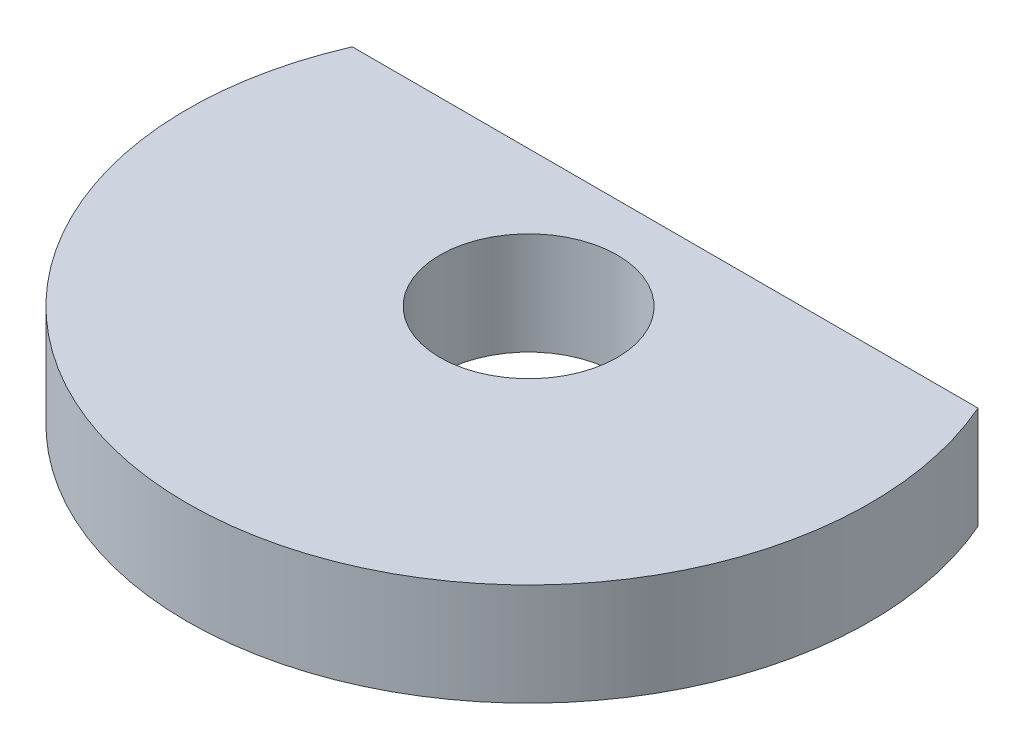
ISO-10303-21;
HEADER;
FILE_DESCRIPTION(('STEP AP214'),'2;1');
FILE_NAME('part.step','',(''),(''),'','','');
FILE_SCHEMA(('AUTOMOTIVE_DESIGN { 1 0 10303 214 1 1 1 1 }'));
ENDSEC;
DATA;
#1=APPLICATION_CONTEXT('core data for automotive mechanical design processes');
#2=APPLICATION_PROTOCOL_DEFINITION('international standard','automotive_design',2000,#1);
#3=PRODUCT_CONTEXT('',#1,'mechanical');
#4=PRODUCT('Part','Part','',(#3));
#5=PRODUCT_RELATED_PRODUCT_CATEGORY('part','',(#4));
#6=PRODUCT_DEFINITION_FORMATION('','',#4);
#7=PRODUCT_DEFINITION_CONTEXT('part definition',#1,'design');
#8=PRODUCT_DEFINITION('design','',#6,#7);
#9=PRODUCT_DEFINITION_SHAPE('','',#8);
#10=(LENGTH_UNIT() NAMED_UNIT(*) SI_UNIT(.MILLI.,.METRE.));
#11=(NAMED_UNIT(*) PLANE_ANGLE_UNIT() SI_UNIT($,.RADIAN.));
#12=(NAMED_UNIT(*) SI_UNIT($,.STERADIAN.) SOLID_ANGLE_UNIT());
#13=UNCERTAINTY_MEASURE_WITH_UNIT(LENGTH_MEASURE(1.E-05),#10,'distance_accuracy_value','');
#14=(GEOMETRIC_REPRESENTATION_CONTEXT(3) GLOBAL_UNCERTAINTY_ASSIGNED_CONTEXT((#13)) GLOBAL_UNIT_ASSIGNED_CONTEXT((#10,
#11,#12)) REPRESENTATION_CONTEXT('',''));
#15=CARTESIAN_POINT('',(0.,0.,0.));
#16=DIRECTION('',(0.,0.,1.));
#17=DIRECTION('',(1.,0.,0.));
#18=AXIS2_PLACEMENT_3D('',#15,#16,#17);
#19=CARTESIAN_POINT('',(0.,3.,-4.));
#20=DIRECTION('',(0.,0.,-1.));
#21=DIRECTION('',(-1.,0.,0.));
#22=AXIS2_PLACEMENT_3D('',#19,#20,#21);
#23=PLANE('',#22);
#24=DIRECTION('',(1.,0.,0.));
#25=VECTOR('',#24,1.);
#26=CARTESIAN_POINT('',(0.,0.,-4.));
#27=LINE('',#26,#25);
#28=CARTESIAN_POINT('',(-9.16515138991168,0.,-4.));
#29=VERTEX_POINT('',#28);
#30=CARTESIAN_POINT('',(9.16515138991168,0.,-4.));
#31=VERTEX_POINT('',#30);
#32=EDGE_CURVE('E71',#29,#31,#27,.T.);
#33=ORIENTED_EDGE('',*,*,#32,.F.);
#34=DIRECTION('',(0.,-1.,0.));
#35=VECTOR('',#34,1.);
#36=CARTESIAN_POINT('',(-9.16515138991168,3.,-4.));
#37=LINE('',#36,#35);
#38=CARTESIAN_POINT('',(-9.16515138991168,3.,-4.));
#39=VERTEX_POINT('',#38);
#40=EDGE_CURVE('E11',#39,#29,#37,.T.);
#41=ORIENTED_EDGE('',*,*,#40,.F.);
#42=DIRECTION('',(1.,0.,0.));
#43=VECTOR('',#42,1.);
#44=CARTESIAN_POINT('',(0.,3.,-4.));
#45=LINE('',#44,#43);
#46=CARTESIAN_POINT('',(9.16515138991168,3.,-4.));
#47=VERTEX_POINT('',#46);
#48=EDGE_CURVE('E72',#39,#47,#45,.T.);
#49=ORIENTED_EDGE('',*,*,#48,.T.);
#50=DIRECTION('',(0.,-1.,0.));
#51=VECTOR('',#50,1.);
#52=CARTESIAN_POINT('',(9.16515138991168,3.,-4.));
#53=LINE('',#52,#51);
#54=EDGE_CURVE('E51',#47,#31,#53,.T.);
#55=ORIENTED_EDGE('',*,*,#54,.T.);
#56=EDGE_LOOP('',(#33,#41,#49,#55));
#57=FACE_BOUND('',#56,.T.);
#58=ADVANCED_FACE('F41',(#57),#23,.T.);
#59=CARTESIAN_POINT('',(0.,3.,0.));
#60=DIRECTION('',(0.,-1.,0.));
#61=DIRECTION('',(0.,0.,-1.));
#62=AXIS2_PLACEMENT_3D('',#59,#60,#61);
#63=CYLINDRICAL_SURFACE('',#62,2.6);
#64=CARTESIAN_POINT('',(0.,3.,0.));
#65=DIRECTION('',(0.,1.,0.));
#66=DIRECTION('',(0.,0.,1.));
#67=AXIS2_PLACEMENT_3D('',#64,#65,#66);
#68=CIRCLE('',#67,2.6);
#69=CARTESIAN_POINT('',(0.,3.,2.6));
#70=VERTEX_POINT('',#69);
#71=EDGE_CURVE('E78',#70,#70,#68,.T.);
#72=ORIENTED_EDGE('',*,*,#71,.T.);
#73=EDGE_LOOP('',(#72));
#74=FACE_BOUND('',#73,.T.);
#75=CARTESIAN_POINT('',(0.,0.,0.));
#76=DIRECTION('',(0.,1.,0.));
#77=DIRECTION('',(0.,0.,1.));
#78=AXIS2_PLACEMENT_3D('',#75,#76,#77);
#79=CIRCLE('',#78,2.6);
#80=CARTESIAN_POINT('',(0.,0.,2.6));
#81=VERTEX_POINT('',#80);
#82=EDGE_CURVE('E82',#81,#81,#79,.T.);
#83=ORIENTED_EDGE('',*,*,#82,.F.);
#84=EDGE_LOOP('',(#83));
#85=FACE_BOUND('',#84,.T.);
#86=ADVANCED_FACE('F43',(#74,#85),#63,.F.);
#87=CARTESIAN_POINT('',(0.,3.,0.));
#88=DIRECTION('',(0.,-1.,0.));
#89=DIRECTION('',(0.,0.,-1.));
#90=AXIS2_PLACEMENT_3D('',#87,#88,#89);
#91=CYLINDRICAL_SURFACE('',#90,10.);
#92=CARTESIAN_POINT('',(0.,0.,0.));
#93=DIRECTION('',(0.,1.,0.));
#94=DIRECTION('',(0.,0.,1.));
#95=AXIS2_PLACEMENT_3D('',#92,#93,#94);
#96=CIRCLE('',#95,10.);
#97=EDGE_CURVE('E74',#29,#31,#96,.T.);
#98=ORIENTED_EDGE('',*,*,#97,.T.);
#99=ORIENTED_EDGE('',*,*,#54,.F.);
#100=CARTESIAN_POINT('',(0.,3.,0.));
#101=DIRECTION('',(0.,1.,0.));
#102=DIRECTION('',(0.,0.,1.));
#103=AXIS2_PLACEMENT_3D('',#100,#101,#102);
#104=CIRCLE('',#103,10.);
#105=EDGE_CURVE('E58',#39,#47,#104,.T.);
#106=ORIENTED_EDGE('',*,*,#105,.F.);
#107=ORIENTED_EDGE('',*,*,#40,.T.);
#108=EDGE_LOOP('',(#98,#99,#106,#107));
#109=FACE_BOUND('',#108,.T.);
#110=ADVANCED_FACE('F75',(#109),#91,.T.);
#111=CARTESIAN_POINT('',(0.,3.,0.));
#112=DIRECTION('',(0.,1.,0.));
#113=DIRECTION('',(0.,0.,1.));
#114=AXIS2_PLACEMENT_3D('',#111,#112,#113);
#115=PLANE('',#114);
#116=ORIENTED_EDGE('',*,*,#71,.F.);
#117=EDGE_LOOP('',(#116));
#118=FACE_BOUND('',#117,.T.);
#119=ORIENTED_EDGE('',*,*,#48,.F.);
#120=ORIENTED_EDGE('',*,*,#105,.T.);
#121=EDGE_LOOP('',(#119,#120));
#122=FACE_BOUND('',#121,.T.);
#123=ADVANCED_FACE('F98',(#118,#122),#115,.T.);
#124=CARTESIAN_POINT('',(0.,0.,0.));
#125=DIRECTION('',(0.,1.,0.));
#126=DIRECTION('',(0.,0.,1.));
#127=AXIS2_PLACEMENT_3D('',#124,#125,#126);
#128=PLANE('',#127);
#129=ORIENTED_EDGE('',*,*,#82,.T.);
#130=EDGE_LOOP('',(#129));
#131=FACE_BOUND('',#130,.T.);
#132=ORIENTED_EDGE('',*,*,#32,.T.);
#133=ORIENTED_EDGE('',*,*,#97,.F.);
#134=EDGE_LOOP('',(#132,#133));
#135=FACE_BOUND('',#134,.T.);
#136=ADVANCED_FACE('F80',(#131,#135),#128,.F.);
#137=CLOSED_SHELL('',(#58,#86,#110,#123,#136));
#138=MANIFOLD_SOLID_BREP('B2',#137);
#139=ADVANCED_BREP_SHAPE_REPRESENTATION('',(#18,#138),#14);
#140=SHAPE_DEFINITION_REPRESENTATION(#9,#139);
ENDSEC;
END-ISO-10303-21;
